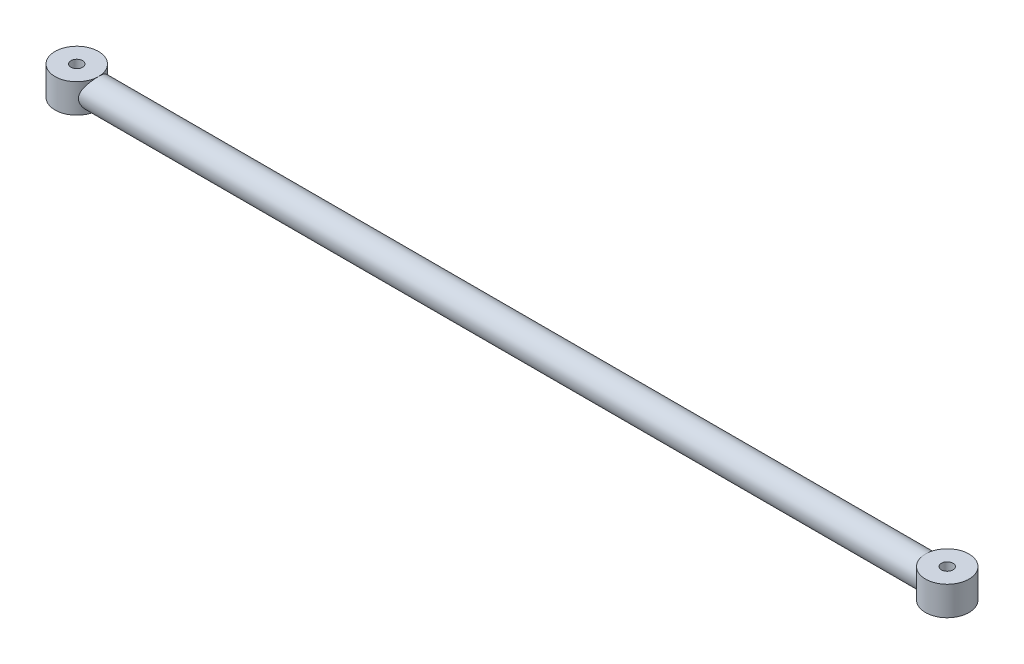
ISO-10303-21;
HEADER;
FILE_DESCRIPTION(('STEP AP214'),'2;1');
FILE_NAME('part.step','',(''),(''),'','','');
FILE_SCHEMA(('AUTOMOTIVE_DESIGN { 1 0 10303 214 1 1 1 1 }'));
ENDSEC;
DATA;
#1=APPLICATION_CONTEXT('core data for automotive mechanical design processes');
#2=APPLICATION_PROTOCOL_DEFINITION('international standard','automotive_design',2000,#1);
#3=PRODUCT_CONTEXT('',#1,'mechanical');
#4=PRODUCT('Part','Part','',(#3));
#5=PRODUCT_RELATED_PRODUCT_CATEGORY('part','',(#4));
#6=PRODUCT_DEFINITION_FORMATION('','',#4);
#7=PRODUCT_DEFINITION_CONTEXT('part definition',#1,'design');
#8=PRODUCT_DEFINITION('design','',#6,#7);
#9=PRODUCT_DEFINITION_SHAPE('','',#8);
#10=(LENGTH_UNIT() NAMED_UNIT(*) SI_UNIT(.MILLI.,.METRE.));
#11=(NAMED_UNIT(*) PLANE_ANGLE_UNIT() SI_UNIT($,.RADIAN.));
#12=(NAMED_UNIT(*) SI_UNIT($,.STERADIAN.) SOLID_ANGLE_UNIT());
#13=UNCERTAINTY_MEASURE_WITH_UNIT(LENGTH_MEASURE(1.E-05),#10,'distance_accuracy_value','');
#14=(GEOMETRIC_REPRESENTATION_CONTEXT(3) GLOBAL_UNCERTAINTY_ASSIGNED_CONTEXT((#13)) GLOBAL_UNIT_ASSIGNED_CONTEXT((#10,
#11,#12)) REPRESENTATION_CONTEXT('',''));
#15=CARTESIAN_POINT('',(0.,0.,0.));
#16=DIRECTION('',(0.,0.,1.));
#17=DIRECTION('',(1.,0.,0.));
#18=AXIS2_PLACEMENT_3D('',#15,#16,#17);
#19=CARTESIAN_POINT('',(0.,10.,0.));
#20=DIRECTION('',(0.,-1.,0.));
#21=DIRECTION('',(0.,0.,-1.));
#22=AXIS2_PLACEMENT_3D('',#19,#20,#21);
#23=CYLINDRICAL_SURFACE('',#22,7.5);
#24=CARTESIAN_POINT('',(5.59016994374947,5.,-5.));
#25=CARTESIAN_POINT('',(5.5901706625174,5.12205388359625,-4.99999964357564));
#26=CARTESIAN_POINT('',(5.59418532981739,5.24411789948403,-4.99552162160794));
#27=CARTESIAN_POINT('',(5.61003991638774,5.48708887638914,-4.97770938209618));
#28=CARTESIAN_POINT('',(5.62188108351868,5.6079956497761,-4.96437375228954));
#29=CARTESIAN_POINT('',(5.65283416335673,5.847752929154,-4.92909864587349));
#30=CARTESIAN_POINT('',(5.67195528501163,5.96660063056802,-4.90714827075304));
#31=CARTESIAN_POINT('',(5.71662095478366,6.20127131799252,-4.85504058407008));
#32=CARTESIAN_POINT('',(5.7421687886341,6.31709272323468,-4.82487907381622));
#33=CARTESIAN_POINT('',(5.82639663379158,6.65668003821921,-4.72342806910663));
#34=CARTESIAN_POINT('',(5.89303629120037,6.8751813364103,-4.64077239770027));
#35=CARTESIAN_POINT('',(6.03960512128253,7.29470249417751,-4.44834576156935));
#36=CARTESIAN_POINT('',(6.11953705272864,7.49571871155765,-4.33856916567418));
#37=CARTESIAN_POINT('',(6.29865991433558,7.9091252663264,-4.07504436525903));
#38=CARTESIAN_POINT('',(6.39891196365178,8.11841562351777,-3.917111460503));
#39=CARTESIAN_POINT('',(6.54866950717716,8.41205464650507,-3.65718550420727));
#40=CARTESIAN_POINT('',(6.59852398957,8.50661752220399,-3.56662594393892));
#41=CARTESIAN_POINT('',(6.69705344049372,8.68868505677082,-3.3779849735163));
#42=CARTESIAN_POINT('',(6.74572816721061,8.77618827704165,-3.27990203817314));
#43=CARTESIAN_POINT('',(6.84778975627652,8.95581205432809,-3.06174885112188));
#44=CARTESIAN_POINT('',(6.90083673852273,9.04676291382604,-2.94055246314321));
#45=CARTESIAN_POINT('',(7.00261387401659,9.21797779217798,-2.68919540612318));
#46=CARTESIAN_POINT('',(7.05134586467213,9.2982463671529,-2.55903859498151));
#47=CARTESIAN_POINT('',(7.14311288700486,9.44719011504436,-2.29042949522774));
#48=CARTESIAN_POINT('',(7.18615113246434,9.51587183413288,-2.15198195090786));
#49=CARTESIAN_POINT('',(7.26523919200859,9.64069315005232,-1.86763465972573));
#50=CARTESIAN_POINT('',(7.30129050280678,9.69683543342512,-1.72173651738078));
#51=CARTESIAN_POINT('',(7.36162681849092,9.79005883635526,-1.44040606590123));
#52=CARTESIAN_POINT('',(7.38677766936309,9.82857099214886,-1.30563322030059));
#53=CARTESIAN_POINT('',(7.42991249444935,9.89430447806799,-1.03224885423915));
#54=CARTESIAN_POINT('',(7.44789787222761,9.92152801943628,-0.893638091239558));
#55=CARTESIAN_POINT('',(7.47614687179729,9.96417435933857,-0.61397210260027));
#56=CARTESIAN_POINT('',(7.48641808298536,9.97960875659256,-0.472919419564069));
#57=CARTESIAN_POINT('',(7.49894084318428,9.9984162055763,-0.189664806486311));
#58=CARTESIAN_POINT('',(7.50119352373448,10.0017909591096,-0.0474630414368964));
#59=CARTESIAN_POINT('',(7.49788711593105,9.99683002098599,0.214926329417986));
#60=CARTESIAN_POINT('',(7.49346652031666,9.99020106877646,0.33516525258883));
#61=CARTESIAN_POINT('',(7.47892220840115,9.96833417713567,0.574546655888795));
#62=CARTESIAN_POINT('',(7.46879682307761,9.95309371827425,0.693688804767769));
#63=CARTESIAN_POINT('',(7.44307061859246,9.91421546893757,0.929951983638574));
#64=CARTESIAN_POINT('',(7.4274716617223,9.89058053450934,1.04707368685166));
#65=CARTESIAN_POINT('',(7.39114068429177,9.83522389783409,1.27859356391292));
#66=CARTESIAN_POINT('',(7.37040667326084,9.80349905960406,1.39299066274564));
#67=CARTESIAN_POINT('',(7.30131486330501,9.69703681289823,1.73005538403762));
#68=CARTESIAN_POINT('',(7.24593117994871,9.61081085923641,1.94778792718831));
#69=CARTESIAN_POINT('',(7.12052338075279,9.4111078189108,2.36556151611647));
#70=CARTESIAN_POINT('',(7.05049659276983,9.29762575786053,2.56559932338025));
#71=CARTESIAN_POINT('',(6.89045638386269,9.03006024279277,2.97069368982936));
#72=CARTESIAN_POINT('',(6.79902578768085,8.87260106479221,3.17295552552388));
#73=CARTESIAN_POINT('',(6.60999945158181,8.53023339768211,3.54999339995416));
#74=CARTESIAN_POINT('',(6.51239433736308,8.34528256627919,3.7247261681595));
#75=CARTESIAN_POINT('',(6.35967478305087,8.03402018008872,3.97696265964104));
#76=CARTESIAN_POINT('',(6.30400799743458,7.91589183940307,4.06438394782657));
#77=CARTESIAN_POINT('',(6.19484436036359,7.67171142735368,4.2289079044222));
#78=CARTESIAN_POINT('',(6.14134799901609,7.54565758252332,4.30600825118179));
#79=CARTESIAN_POINT('',(5.98694245327993,7.15642167168728,4.52077878477497));
#80=CARTESIAN_POINT('',(5.89179835434539,6.88155132549681,4.64241912020699));
#81=CARTESIAN_POINT('',(5.75656527679014,6.38812992147349,4.80833516081298));
#82=CARTESIAN_POINT('',(5.70851355325226,6.17586848148356,4.86478068831081));
#83=CARTESIAN_POINT('',(5.65350806810432,5.85066319889901,4.92834585425333));
#84=CARTESIAN_POINT('',(5.63802041673228,5.74116095113767,4.94601484280339));
#85=CARTESIAN_POINT('',(5.6132864702714,5.52054688860994,4.97407050656186));
#86=CARTESIAN_POINT('',(5.60403790489399,5.40943567436659,4.98445983075943));
#87=CARTESIAN_POINT('',(5.59214106690608,5.18589940571024,4.997803260487));
#88=CARTESIAN_POINT('',(5.58952331669792,5.07347066025993,5.00072298319807));
#89=CARTESIAN_POINT('',(5.59108732012691,4.84872057527093,4.99897430202887));
#90=CARTESIAN_POINT('',(5.59526909006742,4.73639923599042,4.99430587995434));
#91=CARTESIAN_POINT('',(5.61025801127053,4.5127095471556,4.97746238755042));
#92=CARTESIAN_POINT('',(5.62106859529239,4.40134172170081,4.96528342783884));
#93=CARTESIAN_POINT('',(5.64886572819769,4.18041300109456,4.9336347125069));
#94=CARTESIAN_POINT('',(5.66585478194021,4.0708528576679,4.9141619997762));
#95=CARTESIAN_POINT('',(5.72320177022745,3.75666065472961,4.84750655123214));
#96=CARTESIAN_POINT('',(5.77082982352627,3.55521807244575,4.79115844570636));
#97=CARTESIAN_POINT('',(5.88074881106741,3.16464705118105,4.6555719559158));
#98=CARTESIAN_POINT('',(5.94304466833049,2.97552277391524,4.57632588427075));
#99=CARTESIAN_POINT('',(6.09028500694758,2.57451319098662,4.37908973742576));
#100=CARTESIAN_POINT('',(6.17726765213988,2.36563426365981,4.25652155676044));
#101=CARTESIAN_POINT('',(6.35657226537142,1.96893166875292,3.98379742572386));
#102=CARTESIAN_POINT('',(6.44890063945384,1.7811340900701,3.83360788608274));
#103=CARTESIAN_POINT('',(6.59617273726703,1.49744748224256,3.57120985773432));
#104=CARTESIAN_POINT('',(6.65164798701944,1.39428654949147,3.46704479819889));
#105=CARTESIAN_POINT('',(6.76059384112445,1.19705427014105,3.24948474866213));
#106=CARTESIAN_POINT('',(6.81406502122924,1.10298030049269,3.13609243972305));
#107=CARTESIAN_POINT('',(6.91762986331369,0.924601972371946,2.9005088898478));
#108=CARTESIAN_POINT('',(6.96772501047729,0.840293306061031,2.77832156758735));
#109=CARTESIAN_POINT('',(7.06324889339064,0.682193574462971,2.52561765880675));
#110=CARTESIAN_POINT('',(7.10867901103764,0.608399392000351,2.39510355756627));
#111=CARTESIAN_POINT('',(7.18545886075459,0.485283528930507,2.15224191391206));
#112=CARTESIAN_POINT('',(7.21783719911202,0.433983582257362,2.04121853633071));
#113=CARTESIAN_POINT('',(7.27809690900046,0.339310306340049,1.81467232523617));
#114=CARTESIAN_POINT('',(7.30597918543269,0.295935381829555,1.6991504029492));
#115=CARTESIAN_POINT('',(7.35665725512397,0.217605458657127,1.4642485000991));
#116=CARTESIAN_POINT('',(7.37945517519233,0.182646938886476,1.344870156709));
#117=CARTESIAN_POINT('',(7.41946190632175,0.121583530791129,1.10299691877027));
#118=CARTESIAN_POINT('',(7.43667297862896,0.0954750602674704,0.980503306811374));
#119=CARTESIAN_POINT('',(7.46517779300979,0.0523598766374048,0.732635305372838));
#120=CARTESIAN_POINT('',(7.47644323427494,0.0353966863758577,0.607250051109774));
#121=CARTESIAN_POINT('',(7.49265147038709,0.0110212309196953,0.355144734240186));
#122=CARTESIAN_POINT('',(7.49759425522424,0.0036089808458646,0.228424669520747));
#123=CARTESIAN_POINT('',(7.50103025873025,-0.00154563348941496,-0.0252924710734001));
#124=CARTESIAN_POINT('',(7.49952386162054,0.000711426182921558,-0.152289529995143));
#125=CARTESIAN_POINT('',(7.49010159691518,0.0148571234438512,-0.405499509626763));
#126=CARTESIAN_POINT('',(7.48218602101529,0.0267453226982451,-0.531712465759452));
#127=CARTESIAN_POINT('',(7.46095100810477,0.0587529202728431,-0.773178498860274));
#128=CARTESIAN_POINT('',(7.448068464009,0.0782077409701473,-0.888558797390637));
#129=CARTESIAN_POINT('',(7.41724576819145,0.124978122892729,-1.11704156047781));
#130=CARTESIAN_POINT('',(7.399303905766,0.152296343028638,-1.23014324068349));
#131=CARTESIAN_POINT('',(7.33841301643864,0.245573715508718,-1.56492273869531));
#132=CARTESIAN_POINT('',(7.28838026742236,0.322882666524126,-1.78227445561561));
#133=CARTESIAN_POINT('',(7.16979112357417,0.509852973814495,-2.21290412009764));
#134=CARTESIAN_POINT('',(7.1003304156043,0.621127488703141,-2.42521863658466));
#135=CARTESIAN_POINT('',(6.94938601442567,0.87037489056778,-2.82887198732711));
#136=CARTESIAN_POINT('',(6.86789513405988,1.00836375288544,-3.02019816263525));
#137=CARTESIAN_POINT('',(6.684823034606,1.33157302773962,-3.40823875779305));
#138=CARTESIAN_POINT('',(6.582097841658,1.52080858466487,-3.60106785648602));
#139=CARTESIAN_POINT('',(6.37633394651734,1.92778282762101,-3.95399968805939));
#140=CARTESIAN_POINT('',(6.27329506780276,2.14554263863128,-4.11407793841239));
#141=CARTESIAN_POINT('',(6.08460555354049,2.58967205587941,-4.38783158705922));
#142=CARTESIAN_POINT('',(5.99822799554583,2.81411549521951,-4.50411638942043));
#143=CARTESIAN_POINT('',(5.84368671439486,3.28320017359626,-4.70289484194104));
#144=CARTESIAN_POINT('',(5.77548769703612,3.52780104889743,-4.78545413974288));
#145=CARTESIAN_POINT('',(5.67977869968879,3.97696033843683,-4.89840704223489));
#146=CARTESIAN_POINT('',(5.64660042641953,4.17837658974286,-4.93630728698343));
#147=CARTESIAN_POINT('',(5.61296953532588,4.48444930958915,-4.97441665993171));
#148=CARTESIAN_POINT('',(5.6044486251871,4.58713925604258,-4.98399630030355));
#149=CARTESIAN_POINT('',(5.59304922754417,4.79321716479006,-4.99678732833624));
#150=CARTESIAN_POINT('',(5.59016933486227,4.89660494681258,-5.00000030193645));
#151=CARTESIAN_POINT('',(5.59016994374947,5.,-5.));
#152=B_SPLINE_CURVE_WITH_KNOTS('',3,(#24,#25,#26,#27,#28,#29,#30,#31,#32,#33,#34,#35,#36,#37,
#38,#39,#40,#41,#42,#43,#44,#45,#46,#47,#48,#49,#50,#51,#52,#53,#54,#55,#56,#57,#58,#59,#60,#61,
#62,#63,#64,#65,#66,#67,#68,#69,#70,#71,#72,#73,#74,#75,#76,#77,#78,#79,#80,#81,#82,#83,#84,#85,
#86,#87,#88,#89,#90,#91,#92,#93,#94,#95,#96,#97,#98,#99,#100,#101,#102,#103,#104,#105,#106,#107,
#108,#109,#110,#111,#112,#113,#114,#115,#116,#117,#118,#119,#120,#121,#122,#123,#124,#125,#126,
#127,#128,#129,#130,#131,#132,#133,#134,#135,#136,#137,#138,#139,#140,#141,#142,#143,#144,#145,
#146,#147,#148,#149,#150,#151),.UNSPECIFIED.,.T.,.F.,(4,2,2,2,2,2,2,2,2,2,2,2,2,2,2,2,2,2,2,2,2,
2,2,2,2,2,2,2,2,2,2,2,2,2,2,2,2,2,2,2,2,2,2,2,2,2,2,2,2,2,2,2,2,2,2,2,2,2,2,2,2,2,2,4),(0.,
0.366033458672971,0.732125291964981,1.09868176861093,1.46542603387433,2.19101005626679,
2.91674485988983,3.75544535494702,4.17545267241678,4.59554536276913,5.07654048587601,
5.55732979684682,6.03784656220448,6.51826027911534,6.94483544019723,7.37132700312484,
7.79739842098889,8.22340971116697,8.5844789808514,8.94565394170145,9.30670613775418,
9.6678985059721,10.3866783482082,11.1055894714534,11.9189706975283,12.7336179187696,
13.2045491800071,13.6755861977901,14.6151303537652,15.2867708701996,15.622382916626,
15.9578727740365,16.2949041462506,16.6319363265738,16.9691431880032,17.3064869116396,
17.9474746151418,18.5886777636667,19.3580440738515,20.1283522425805,20.5981214540359,
21.0677546537896,21.5371798854196,22.0064656580781,22.3856357517165,22.7647294360678,
23.1436642451331,23.5224454906107,23.9030138094417,24.2835827307772,24.664128979362,
25.0446579094287,25.3973949464228,25.7502513974508,26.4553650385285,27.2012784158551,
27.9476392394848,28.8113869983205,29.6757781016727,30.4741849861256,31.2710302574382,
31.891247248814,32.201401082632,32.5114776472832),.UNSPECIFIED.);
#153=CARTESIAN_POINT('',(7.5,10.,0.));
#154=VERTEX_POINT('',#153);
#155=CARTESIAN_POINT('',(7.5,0.,0.));
#156=VERTEX_POINT('',#155);
#157=EDGE_CURVE('E74',#154,#156,#152,.T.);
#158=ORIENTED_EDGE('',*,*,#157,.F.);
#159=CARTESIAN_POINT('',(0.,10.,0.));
#160=DIRECTION('',(0.,1.,0.));
#161=DIRECTION('',(0.,0.,1.));
#162=AXIS2_PLACEMENT_3D('',#159,#160,#161);
#163=CIRCLE('',#162,7.5);
#164=EDGE_CURVE('E45',#154,#154,#163,.T.);
#165=ORIENTED_EDGE('',*,*,#164,.F.);
#166=CARTESIAN_POINT('',(7.5,10.,0.));
#167=CARTESIAN_POINT('',(7.49999996320963,9.99999996332958,0.125608018588548));
#168=CARTESIAN_POINT('',(7.49683780664486,9.99526045609656,0.251216670884861));
#169=CARTESIAN_POINT('',(7.48426887523008,9.97637719344278,0.501407130429646));
#170=CARTESIAN_POINT('',(7.47486206751269,9.96223338852455,0.625988932270019));
#171=CARTESIAN_POINT('',(7.45003382341075,9.92475388496588,0.873171719994341));
#172=CARTESIAN_POINT('',(7.43461128487837,9.90141650195336,0.99577233861483));
#173=CARTESIAN_POINT('',(7.39811136676745,9.84587344243482,1.23813427215697));
#174=CARTESIAN_POINT('',(7.37703158367565,9.8136639964275,1.35789435666897));
#175=CARTESIAN_POINT('',(7.32981525375344,9.74098638489601,1.59314893798378));
#176=CARTESIAN_POINT('',(7.30370546494928,9.70056186113887,1.70866231614512));
#177=CARTESIAN_POINT('',(7.24690654349893,9.61181215495731,1.93546860882204));
#178=CARTESIAN_POINT('',(7.21621562725325,9.56348389461676,2.04675985824914));
#179=CARTESIAN_POINT('',(7.11817827260879,9.40738741786011,2.37341381762447));
#180=CARTESIAN_POINT('',(7.04482484943509,9.28844372586616,2.58175996249981));
#181=CARTESIAN_POINT('',(6.88067945428324,9.01334849863612,2.99324442404474));
#182=CARTESIAN_POINT('',(6.78893589581815,8.85489609546823,3.19444057723902));
#183=CARTESIAN_POINT('',(6.59954434905881,8.51065910883303,3.56933031224002));
#184=CARTESIAN_POINT('',(6.5018880214744,8.32483536621252,3.74298373794807));
#185=CARTESIAN_POINT('',(6.34919628009922,8.01202024399453,3.99366214280298));
#186=CARTESIAN_POINT('',(6.29351311736736,7.89316385177453,4.08060552383283));
#187=CARTESIAN_POINT('',(6.18443450280949,7.6475199343164,4.24410607449973));
#188=CARTESIAN_POINT('',(6.13103957232405,7.52073061769333,4.32066088576892));
#189=CARTESIAN_POINT('',(5.97715554289977,7.12929062591451,4.53366662201286));
#190=CARTESIAN_POINT('',(5.88264084043698,6.85293596756271,4.65396866792279));
#191=CARTESIAN_POINT('',(5.74940066178898,6.35814923705589,4.81686735383668));
#192=CARTESIAN_POINT('',(5.70244638338744,6.1460313437967,4.87187088253824));
#193=CARTESIAN_POINT('',(5.64915905133327,5.8212576931191,4.93332515657475));
#194=CARTESIAN_POINT('',(5.63425589706967,5.7119348309963,4.95029943249));
#195=CARTESIAN_POINT('',(5.61069296640748,5.49175738437376,4.97699249744458));
#196=CARTESIAN_POINT('',(5.6020309479698,5.38090336452041,4.98671389202271));
#197=CARTESIAN_POINT('',(5.59128886396067,5.15799242550824,4.99875512937179));
#198=CARTESIAN_POINT('',(5.58923742257986,5.04593237757908,5.00104278396599));
#199=CARTESIAN_POINT('',(5.5918825450767,4.82199293530448,4.9980849918467));
#200=CARTESIAN_POINT('',(5.59657913187616,4.71011354157399,4.99283951954458));
#201=CARTESIAN_POINT('',(5.61252620448123,4.48736390866386,4.97490634187683));
#202=CARTESIAN_POINT('',(5.62378029227563,4.37649425814924,4.96221454627213));
#203=CARTESIAN_POINT('',(5.65238050674852,4.15660343554882,4.92961024185719));
#204=CARTESIAN_POINT('',(5.66972910561612,4.04758303243614,4.90969480272766));
#205=CARTESIAN_POINT('',(5.72818076911837,3.73396543495533,4.84163703367357));
#206=CARTESIAN_POINT('',(5.77653702126334,3.53263370716592,4.78429713380928));
#207=CARTESIAN_POINT('',(5.88774075486078,3.14240371216595,4.64674861534595));
#208=CARTESIAN_POINT('',(5.95059300345544,2.9535095614946,4.56653247162609));
#209=CARTESIAN_POINT('',(6.09910267461486,2.55245469859575,4.36685173998334));
#210=CARTESIAN_POINT('',(6.18679835791932,2.34337672502797,4.24272264703471));
#211=CARTESIAN_POINT('',(6.36729804082079,1.94651500271284,3.96670264496564));
#212=CARTESIAN_POINT('',(6.46010824109834,1.75875798567564,3.81477749526626));
#213=CARTESIAN_POINT('',(6.60779163713999,1.47562744199996,3.54969108213473));
#214=CARTESIAN_POINT('',(6.66328847782504,1.37286916827723,3.44464766421749));
#215=CARTESIAN_POINT('',(6.77217054484313,1.17652286029991,3.22531791748826));
#216=CARTESIAN_POINT('',(6.82555639146258,1.0829321201714,3.11103433427816));
#217=CARTESIAN_POINT('',(6.92883688982357,0.905617664374111,2.87366828778324));
#218=CARTESIAN_POINT('',(6.97873321853711,0.821889195729718,2.75059010925358));
#219=CARTESIAN_POINT('',(7.07374288615761,0.665057023586969,2.49611507932344));
#220=CARTESIAN_POINT('',(7.11885767470596,0.591950097400154,2.36472076856899));
#221=CARTESIAN_POINT('',(7.1947926112122,0.470449962892977,2.12083178608808));
#222=CARTESIAN_POINT('',(7.22668145195663,0.420021256692504,2.00967972723592));
#223=CARTESIAN_POINT('',(7.2859316600916,0.32709058125619,1.78295269143194));
#224=CARTESIAN_POINT('',(7.31329394408637,0.284587007000184,1.66737861576613));
#225=CARTESIAN_POINT('',(7.36291212748662,0.207993540162689,1.43245611415626));
#226=CARTESIAN_POINT('',(7.38517017742725,0.173900103730211,1.31310930196114));
#227=CARTESIAN_POINT('',(7.42408961793734,0.114551323245833,1.07138735730615));
#228=CARTESIAN_POINT('',(7.44075325872844,0.0892924255338536,0.94901346373659));
#229=CARTESIAN_POINT('',(7.4681644674329,0.0478566795824793,0.701493288803489));
#230=CARTESIAN_POINT('',(7.4788845658993,0.0317219942473324,0.57633687025973));
#231=CARTESIAN_POINT('',(7.4940239148013,0.00896134388119637,0.324780008160029));
#232=CARTESIAN_POINT('',(7.49844315700379,0.00233539127495145,0.198379562978777));
#233=CARTESIAN_POINT('',(7.50086789804063,-0.00130194416532314,-0.0546163050195388));
#234=CARTESIAN_POINT('',(7.49887366122603,0.0016862767232409,-0.18121171958537));
#235=CARTESIAN_POINT('',(7.48852351947421,0.0172278979729268,-0.43354493783257));
#236=CARTESIAN_POINT('',(7.48016788605485,0.0297808900894156,-0.559282777885931));
#237=CARTESIAN_POINT('',(7.45811180800349,0.0630398424416899,-0.800084092730026));
#238=CARTESIAN_POINT('',(7.44483013834048,0.0831079633674689,-0.91527468950311));
#239=CARTESIAN_POINT('',(7.41323727394235,0.131077444891408,-1.14332502618366));
#240=CARTESIAN_POINT('',(7.39492437584217,0.158981458468383,-1.25618396274927));
#241=CARTESIAN_POINT('',(7.33297199401165,0.253967301110013,-1.59016819827962));
#242=CARTESIAN_POINT('',(7.28229985688257,0.332350843413179,-1.80689828647146));
#243=CARTESIAN_POINT('',(7.16240567052806,0.521637142016869,-2.2366977314704));
#244=CARTESIAN_POINT('',(7.09224590701723,0.634222108945026,-2.44875011842611));
#245=CARTESIAN_POINT('',(6.94004723718924,0.88608150005795,-2.8516978970661));
#246=CARTESIAN_POINT('',(6.85800100215921,1.02537240729556,-3.04258010694991));
#247=CARTESIAN_POINT('',(6.67386338599776,1.35152024255087,-3.42963933761377));
#248=CARTESIAN_POINT('',(6.57065384591325,1.54241580633922,-3.62188054324072));
#249=CARTESIAN_POINT('',(6.36427940129081,1.95277841863379,-3.97334834714672));
#250=CARTESIAN_POINT('',(6.26111457639159,2.17226504546276,-4.13255212685989));
#251=CARTESIAN_POINT('',(6.07349195966786,2.61785607980173,-4.40311961015303));
#252=CARTESIAN_POINT('',(5.98818993185448,2.8418301361395,-4.51739093945808));
#253=CARTESIAN_POINT('',(5.83597435045316,3.30968157872016,-4.71240530724639));
#254=CARTESIAN_POINT('',(5.76902777392137,3.55352218410378,-4.79320869285461));
#255=CARTESIAN_POINT('',(5.67333023681701,4.01141135057003,-4.90589604497064));
#256=CARTESIAN_POINT('',(5.63987506376385,4.22292997208489,-4.94396476310194));
#257=CARTESIAN_POINT('',(5.59698654785069,4.65143275638778,-4.99248032394649));
#258=CARTESIAN_POINT('',(5.58752711368552,4.8684107234815,-5.00295716862677));
#259=CARTESIAN_POINT('',(5.59410544900805,5.30160929715586,-4.99559738764621));
#260=CARTESIAN_POINT('',(5.61015831597501,5.51782937934327,-4.97774399693959));
#261=CARTESIAN_POINT('',(5.66525973970472,5.94335263717476,-4.91492740617482));
#262=CARTESIAN_POINT('',(5.7043389738479,6.15264619119368,-4.8699280383881));
#263=CARTESIAN_POINT('',(5.81317852459072,6.61430721309001,-4.73981418276009));
#264=CARTESIAN_POINT('',(5.88833948649796,6.86329193737393,-4.64720557432273));
#265=CARTESIAN_POINT('',(6.0137282216154,7.2197721527126,-4.48217153169634));
#266=CARTESIAN_POINT('',(6.05768608443999,7.33588098122704,-4.4227291606703));
#267=CARTESIAN_POINT('',(6.14853438480218,7.5622633756569,-4.29553797555823));
#268=CARTESIAN_POINT('',(6.19542487694525,7.67253683284727,-4.22778900678103));
#269=CARTESIAN_POINT('',(6.34038233699541,7.99813157273274,-4.0100125161287));
#270=CARTESIAN_POINT('',(6.44119239434723,8.20406498890247,-3.84739387541879));
#271=CARTESIAN_POINT('',(6.5908294854328,8.49223623047968,-3.58070368138863));
#272=CARTESIAN_POINT('',(6.64046727146307,8.5848751310009,-3.48796686520542));
#273=CARTESIAN_POINT('',(6.73828470699057,8.76298200605058,-3.29502624182907));
#274=CARTESIAN_POINT('',(6.78646402214188,8.84844834415119,-3.19482074044039));
#275=CARTESIAN_POINT('',(6.88712610322217,9.02347385839299,-2.97228582382091));
#276=CARTESIAN_POINT('',(6.93922872778526,9.11184847540997,-2.84884898400047));
#277=CARTESIAN_POINT('',(7.03877400576411,9.27770219318705,-2.59315796105783));
#278=CARTESIAN_POINT('',(7.08621876519301,9.35518622493486,-2.46090780863046));
#279=CARTESIAN_POINT('',(7.17506685821063,9.49830278427693,-2.18836443414477));
#280=CARTESIAN_POINT('',(7.21647581452225,9.56394635570691,-2.04807886951547));
#281=CARTESIAN_POINT('',(7.29200187013099,9.68245428044414,-1.76034275764725));
#282=CARTESIAN_POINT('',(7.32612152964091,9.73532312146547,-1.61289474847383));
#283=CARTESIAN_POINT('',(7.37927647812224,9.81710032821547,-1.34555428333911));
#284=CARTESIAN_POINT('',(7.39997893582426,9.84872238892977,-1.22681585673932));
#285=CARTESIAN_POINT('',(7.43582405760531,9.90325435730034,-0.986541218916703));
#286=CARTESIAN_POINT('',(7.45096786434905,9.9261660555379,-0.865005588166456));
#287=CARTESIAN_POINT('',(7.47533722218222,9.96294834023699,-0.620058880061074));
#288=CARTESIAN_POINT('',(7.48456629083545,9.97682430043647,-0.496648962158442));
#289=CARTESIAN_POINT('',(7.49689781286771,9.99535032150822,-0.24882626170185));
#290=CARTESIAN_POINT('',(7.50000003644048,10.0000000363217,-0.12441344170668));
#291=CARTESIAN_POINT('',(7.5,10.,0.));
#292=B_SPLINE_CURVE_WITH_KNOTS('',3,(#166,#167,#168,#169,#170,#171,#172,#173,#174,#175,#176,
#177,#178,#179,#180,#181,#182,#183,#184,#185,#186,#187,#188,#189,#190,#191,#192,#193,#194,#195,
#196,#197,#198,#199,#200,#201,#202,#203,#204,#205,#206,#207,#208,#209,#210,#211,#212,#213,#214,
#215,#216,#217,#218,#219,#220,#221,#222,#223,#224,#225,#226,#227,#228,#229,#230,#231,#232,#233,
#234,#235,#236,#237,#238,#239,#240,#241,#242,#243,#244,#245,#246,#247,#248,#249,#250,#251,#252,
#253,#254,#255,#256,#257,#258,#259,#260,#261,#262,#263,#264,#265,#266,#267,#268,#269,#270,#271,
#272,#273,#274,#275,#276,#277,#278,#279,#280,#281,#282,#283,#284,#285,#286,#287,#288,#289,#290,
#291),.UNSPECIFIED.,.T.,.F.,(4,2,2,2,2,2,2,2,2,2,2,2,2,2,2,2,2,2,2,2,2,2,2,2,2,2,2,2,2,2,2,2,2,
2,2,2,2,2,2,2,2,2,2,2,2,2,2,2,2,2,2,2,2,2,2,2,2,2,2,2,2,2,4),(0.,0.376697150092868,
0.7533962828654,1.13016446348966,1.5070929703719,1.88206910413628,2.2571916123895,
3.00679232609858,3.82000195441008,4.63438651949459,5.10618372652057,5.57808786035319,
6.5193034140896,7.18876311985436,7.52328813363274,7.85769291407032,8.19354375486222,
8.52939573647986,8.86543237335315,9.20160547846822,9.84356710192613,10.4857401421745,
11.2585349135694,12.032288141549,12.5030398312138,12.9736521532471,13.44403673454,
13.9142782967795,14.2923626335413,14.6703703162267,15.0482184414745,15.4259144034603,
15.8053417246619,16.184769541648,16.5641817195628,16.9435777042718,17.2962009039366,
17.6489436346054,18.3538353932503,19.1014251855315,19.8494778884237,20.7158209183258,
21.5827603441875,22.3763648974055,23.1685321808116,23.8182177151969,24.4671965231208,
25.1165595219072,25.7667896111035,26.5902817323984,27.0029102138176,27.4155463806554,
28.2552096763187,28.6754157798874,29.0957174947647,29.5765774176914,30.0572189128906,
30.5374097593981,31.0174316706402,31.3908313299587,31.7641541882901,32.1372548206284,
32.5103694469936),.UNSPECIFIED.);
#293=EDGE_CURVE('E11',#156,#154,#292,.T.);
#294=ORIENTED_EDGE('',*,*,#293,.F.);
#295=CARTESIAN_POINT('',(0.,0.,0.));
#296=DIRECTION('',(0.,1.,0.));
#297=DIRECTION('',(0.,0.,1.));
#298=AXIS2_PLACEMENT_3D('',#295,#296,#297);
#299=CIRCLE('',#298,7.5);
#300=EDGE_CURVE('E124',#156,#156,#299,.T.);
#301=ORIENTED_EDGE('',*,*,#300,.T.);
#302=EDGE_LOOP('',(#158,#165,#294,#301));
#303=FACE_BOUND('',#302,.T.);
#304=ADVANCED_FACE('F33',(#303),#23,.T.);
#305=CARTESIAN_POINT('',(0.,10.,0.));
#306=DIRECTION('',(0.,1.,0.));
#307=DIRECTION('',(0.,0.,1.));
#308=AXIS2_PLACEMENT_3D('',#305,#306,#307);
#309=PLANE('',#308);
#310=ORIENTED_EDGE('',*,*,#164,.T.);
#311=EDGE_LOOP('',(#310));
#312=FACE_BOUND('',#311,.T.);
#313=CARTESIAN_POINT('',(0.,10.,0.));
#314=DIRECTION('',(0.,1.,0.));
#315=DIRECTION('',(0.,0.,1.));
#316=AXIS2_PLACEMENT_3D('',#313,#314,#315);
#317=CIRCLE('',#316,2.);
#318=CARTESIAN_POINT('',(0.,10.,2.));
#319=VERTEX_POINT('',#318);
#320=EDGE_CURVE('E88',#319,#319,#317,.T.);
#321=ORIENTED_EDGE('',*,*,#320,.F.);
#322=EDGE_LOOP('',(#321));
#323=FACE_BOUND('',#322,.T.);
#324=ADVANCED_FACE('F114',(#312,#323),#309,.T.);
#325=CARTESIAN_POINT('',(0.,0.,0.));
#326=DIRECTION('',(0.,1.,0.));
#327=DIRECTION('',(0.,0.,1.));
#328=AXIS2_PLACEMENT_3D('',#325,#326,#327);
#329=PLANE('',#328);
#330=ORIENTED_EDGE('',*,*,#300,.F.);
#331=EDGE_LOOP('',(#330));
#332=FACE_BOUND('',#331,.T.);
#333=CARTESIAN_POINT('',(0.,0.,0.));
#334=DIRECTION('',(0.,1.,0.));
#335=DIRECTION('',(0.,0.,1.));
#336=AXIS2_PLACEMENT_3D('',#333,#334,#335);
#337=CIRCLE('',#336,2.);
#338=CARTESIAN_POINT('',(0.,0.,2.));
#339=VERTEX_POINT('',#338);
#340=EDGE_CURVE('E68',#339,#339,#337,.T.);
#341=ORIENTED_EDGE('',*,*,#340,.T.);
#342=EDGE_LOOP('',(#341));
#343=FACE_BOUND('',#342,.T.);
#344=ADVANCED_FACE('F118',(#332,#343),#329,.F.);
#345=CARTESIAN_POINT('',(0.,10.,0.));
#346=DIRECTION('',(0.,-1.,0.));
#347=DIRECTION('',(0.,0.,-1.));
#348=AXIS2_PLACEMENT_3D('',#345,#346,#347);
#349=CYLINDRICAL_SURFACE('',#348,2.);
#350=ORIENTED_EDGE('',*,*,#320,.T.);
#351=EDGE_LOOP('',(#350));
#352=FACE_BOUND('',#351,.T.);
#353=ORIENTED_EDGE('',*,*,#340,.F.);
#354=EDGE_LOOP('',(#353));
#355=FACE_BOUND('',#354,.T.);
#356=ADVANCED_FACE('F126',(#352,#355),#349,.F.);
#357=CARTESIAN_POINT('',(307.501,5.,0.));
#358=DIRECTION('',(-1.,0.,0.));
#359=DIRECTION('',(0.,0.,1.));
#360=AXIS2_PLACEMENT_3D('',#357,#358,#359);
#361=CYLINDRICAL_SURFACE('',#360,5.);
#362=CARTESIAN_POINT('',(294.40983005625,5.,5.));
#363=CARTESIAN_POINT('',(294.409829337483,4.87794611640375,4.99999964357564));
#364=CARTESIAN_POINT('',(294.405814670183,4.75588210051598,4.99552162160794));
#365=CARTESIAN_POINT('',(294.389960083612,4.51291112361087,4.97770938209618));
#366=CARTESIAN_POINT('',(294.378118916481,4.3920043502239,4.96437375228954));
#367=CARTESIAN_POINT('',(294.347165836643,4.152247070846,4.92909864587349));
#368=CARTESIAN_POINT('',(294.328044714988,4.03339936943199,4.90714827075304));
#369=CARTESIAN_POINT('',(294.283379045216,3.79872868200749,4.85504058407008));
#370=CARTESIAN_POINT('',(294.257831211366,3.68290727676532,4.82487907381622));
#371=CARTESIAN_POINT('',(294.173603366208,3.34331996178078,4.72342806910662));
#372=CARTESIAN_POINT('',(294.1069637088,3.12481866358968,4.64077239770027));
#373=CARTESIAN_POINT('',(293.960394878717,2.70529750582248,4.44834576156934));
#374=CARTESIAN_POINT('',(293.880462947271,2.50428128844234,4.33856916567417));
#375=CARTESIAN_POINT('',(293.701340085664,2.09087473367359,4.07504436525902));
#376=CARTESIAN_POINT('',(293.601088036348,1.88158437648223,3.917111460503));
#377=CARTESIAN_POINT('',(293.451330492823,1.58794535349493,3.65718550420726));
#378=CARTESIAN_POINT('',(293.40147601043,1.493382477796,3.56662594393891));
#379=CARTESIAN_POINT('',(293.302946559506,1.31131494322917,3.37798497351629));
#380=CARTESIAN_POINT('',(293.254271832789,1.22381172295835,3.27990203817314));
#381=CARTESIAN_POINT('',(293.152210243723,1.04418794567191,3.06174885112189));
#382=CARTESIAN_POINT('',(293.099163261477,0.953237086173965,2.94055246314323));
#383=CARTESIAN_POINT('',(292.997386125983,0.78202220782203,2.68919540612319));
#384=CARTESIAN_POINT('',(292.948654135328,0.701753632847106,2.55903859498152));
#385=CARTESIAN_POINT('',(292.856887112995,0.552809884955645,2.29042949522774));
#386=CARTESIAN_POINT('',(292.813848867536,0.484128165867123,2.15198195090786));
#387=CARTESIAN_POINT('',(292.734760807991,0.359306849947681,1.86763465972573));
#388=CARTESIAN_POINT('',(292.698709497193,0.303164566574879,1.72173651738078));
#389=CARTESIAN_POINT('',(292.638373181509,0.20994116364474,1.44040606590122));
#390=CARTESIAN_POINT('',(292.613222330637,0.171429007851139,1.30563322030059));
#391=CARTESIAN_POINT('',(292.570087505551,0.105695521932006,1.03224885423916));
#392=CARTESIAN_POINT('',(292.552102127772,0.0784719805637175,0.893638091239559));
#393=CARTESIAN_POINT('',(292.523853128203,0.0358256406614302,0.613972102600271));
#394=CARTESIAN_POINT('',(292.513581917015,0.020391243407445,0.472919419564069));
#395=CARTESIAN_POINT('',(292.501059156816,0.00158379442370092,0.189664806486308));
#396=CARTESIAN_POINT('',(292.498806476266,-0.00179095910955939,0.0474630414368909));
#397=CARTESIAN_POINT('',(292.502112884069,0.00316997901401056,-0.214926329417993));
#398=CARTESIAN_POINT('',(292.506533479683,0.00979893122354276,-0.335165252588837));
#399=CARTESIAN_POINT('',(292.521077791599,0.0316658228643305,-0.574546655888803));
#400=CARTESIAN_POINT('',(292.531203176922,0.0469062817257524,-0.693688804767778));
#401=CARTESIAN_POINT('',(292.556929381407,0.0857845310624285,-0.92995198363858));
#402=CARTESIAN_POINT('',(292.572528338278,0.109419465490661,-1.04707368685166));
#403=CARTESIAN_POINT('',(292.608859315708,0.164776102165908,-1.27859356391292));
#404=CARTESIAN_POINT('',(292.629593326739,0.196500940395941,-1.39299066274564));
#405=CARTESIAN_POINT('',(292.698685136695,0.302963187101768,-1.73005538403762));
#406=CARTESIAN_POINT('',(292.754068820051,0.389189140763589,-1.94778792718831));
#407=CARTESIAN_POINT('',(292.879476619247,0.588892181089193,-2.36556151611647));
#408=CARTESIAN_POINT('',(292.94950340723,0.702374242139469,-2.56559932338025));
#409=CARTESIAN_POINT('',(293.109543616137,0.96993975720722,-2.97069368982935));
#410=CARTESIAN_POINT('',(293.200974212319,1.12739893520778,-3.17295552552387));
#411=CARTESIAN_POINT('',(293.390000548418,1.46976660231788,-3.54999339995415));
#412=CARTESIAN_POINT('',(293.487605662637,1.65471743372081,-3.7247261681595));
#413=CARTESIAN_POINT('',(293.640325216949,1.96597981991128,-3.97696265964104));
#414=CARTESIAN_POINT('',(293.695992002565,2.08410816059692,-4.06438394782657));
#415=CARTESIAN_POINT('',(293.805155639636,2.32828857264631,-4.22890790442219));
#416=CARTESIAN_POINT('',(293.858652000984,2.45434241747667,-4.30600825118179));
#417=CARTESIAN_POINT('',(294.01305754672,2.84357832831272,-4.52077878477497));
#418=CARTESIAN_POINT('',(294.108201645655,3.11844867450318,-4.64241912020698));
#419=CARTESIAN_POINT('',(294.24343472321,3.6118700785265,-4.80833516081298));
#420=CARTESIAN_POINT('',(294.291486446748,3.82413151851644,-4.86478068831081));
#421=CARTESIAN_POINT('',(294.346491931896,4.14933680110098,-4.92834585425333));
#422=CARTESIAN_POINT('',(294.361979583268,4.25883904886233,-4.94601484280339));
#423=CARTESIAN_POINT('',(294.386713529729,4.47945311139006,-4.97407050656186));
#424=CARTESIAN_POINT('',(294.395962095106,4.59056432563341,-4.98445983075943));
#425=CARTESIAN_POINT('',(294.407858933094,4.81410059428975,-4.997803260487));
#426=CARTESIAN_POINT('',(294.410476683302,4.92652933974006,-5.00072298319807));
#427=CARTESIAN_POINT('',(294.408912679873,5.15127942472906,-4.99897430202887));
#428=CARTESIAN_POINT('',(294.404730909933,5.26360076400957,-4.99430587995434));
#429=CARTESIAN_POINT('',(294.389741988729,5.48729045284439,-4.97746238755042));
#430=CARTESIAN_POINT('',(294.378931404708,5.59865827829918,-4.96528342783884));
#431=CARTESIAN_POINT('',(294.351134271802,5.81958699890543,-4.9336347125069));
#432=CARTESIAN_POINT('',(294.33414521806,5.9291471423321,-4.9141619997762));
#433=CARTESIAN_POINT('',(294.276798229773,6.24333934527038,-4.84750655123214));
#434=CARTESIAN_POINT('',(294.229170176474,6.44478192755424,-4.79115844570636));
#435=CARTESIAN_POINT('',(294.119251188933,6.83535294881895,-4.6555719559158));
#436=CARTESIAN_POINT('',(294.056955331669,7.02447722608475,-4.57632588427075));
#437=CARTESIAN_POINT('',(293.909714993052,7.42548680901337,-4.37908973742576));
#438=CARTESIAN_POINT('',(293.82273234786,7.63436573634018,-4.25652155676045));
#439=CARTESIAN_POINT('',(293.643427734629,8.03106833124707,-3.98379742572387));
#440=CARTESIAN_POINT('',(293.551099360546,8.2188659099299,-3.83360788608275));
#441=CARTESIAN_POINT('',(293.403827262733,8.50255251775744,-3.57120985773432));
#442=CARTESIAN_POINT('',(293.348352012981,8.60571345050853,-3.46704479819889));
#443=CARTESIAN_POINT('',(293.239406158876,8.80294572985895,-3.24948474866213));
#444=CARTESIAN_POINT('',(293.185934978771,8.89701969950731,-3.13609243972305));
#445=CARTESIAN_POINT('',(293.082370136686,9.07539802762805,-2.9005088898478));
#446=CARTESIAN_POINT('',(293.032274989523,9.15970669393897,-2.77832156758735));
#447=CARTESIAN_POINT('',(292.936751106609,9.31780642553703,-2.52561765880676));
#448=CARTESIAN_POINT('',(292.891320988962,9.39160060799965,-2.39510355756628));
#449=CARTESIAN_POINT('',(292.814541139245,9.51471647106949,-2.15224191391207));
#450=CARTESIAN_POINT('',(292.782162800888,9.56601641774264,-2.04121853633072));
#451=CARTESIAN_POINT('',(292.721903091,9.66068969365995,-1.81467232523617));
#452=CARTESIAN_POINT('',(292.694020814567,9.70406461817044,-1.6991504029492));
#453=CARTESIAN_POINT('',(292.643342744876,9.78239454134287,-1.46424850009911));
#454=CARTESIAN_POINT('',(292.620544824808,9.81735306111352,-1.34487015670901));
#455=CARTESIAN_POINT('',(292.580538093678,9.87841646920887,-1.10299691877028));
#456=CARTESIAN_POINT('',(292.563327021371,9.90452493973253,-0.980503306811385));
#457=CARTESIAN_POINT('',(292.53482220699,9.94764012336259,-0.732635305372851));
#458=CARTESIAN_POINT('',(292.523556765725,9.96460331362414,-0.607250051109789));
#459=CARTESIAN_POINT('',(292.507348529613,9.9889787690803,-0.355144734240202));
#460=CARTESIAN_POINT('',(292.502405744776,9.99639101915414,-0.228424669520762));
#461=CARTESIAN_POINT('',(292.49896974127,10.0015456334894,0.025292471073386));
#462=CARTESIAN_POINT('',(292.500476138379,9.99928857381708,0.152289529995129));
#463=CARTESIAN_POINT('',(292.509898403085,9.98514287655615,0.40549950962675));
#464=CARTESIAN_POINT('',(292.517813978985,9.97325467730175,0.531712465759439));
#465=CARTESIAN_POINT('',(292.539048991895,9.94124707972716,0.773178498860261));
#466=CARTESIAN_POINT('',(292.551931535991,9.92179225902986,0.888558797390624));
#467=CARTESIAN_POINT('',(292.582754231809,9.87502187710728,1.1170415604778));
#468=CARTESIAN_POINT('',(292.600696094234,9.84770365697137,1.23014324068348));
#469=CARTESIAN_POINT('',(292.661586983561,9.75442628449128,1.5649227386953));
#470=CARTESIAN_POINT('',(292.711619732578,9.67711733347588,1.7822744556156));
#471=CARTESIAN_POINT('',(292.830208876426,9.49014702618551,2.21290412009762));
#472=CARTESIAN_POINT('',(292.899669584396,9.37887251129687,2.42521863658465));
#473=CARTESIAN_POINT('',(293.050613985574,9.12962510943223,2.8288719873271));
#474=CARTESIAN_POINT('',(293.13210486594,8.99163624711457,3.02019816263524));
#475=CARTESIAN_POINT('',(293.315176965394,8.6684269722604,3.40823875779304));
#476=CARTESIAN_POINT('',(293.417902158342,8.47919141533515,3.601067856486));
#477=CARTESIAN_POINT('',(293.623666053483,8.072217172379,3.95399968805937));
#478=CARTESIAN_POINT('',(293.726704932197,7.85445736136873,4.11407793841239));
#479=CARTESIAN_POINT('',(293.915394446459,7.41032794412059,4.38783158705921));
#480=CARTESIAN_POINT('',(294.001772004454,7.18588450478049,4.50411638942043));
#481=CARTESIAN_POINT('',(294.156313285605,6.71679982640374,4.70289484194104));
#482=CARTESIAN_POINT('',(294.224512302964,6.47219895110256,4.78545413974288));
#483=CARTESIAN_POINT('',(294.320221300311,6.02303966156316,4.89840704223489));
#484=CARTESIAN_POINT('',(294.35339957358,5.82162341025714,4.93630728698344));
#485=CARTESIAN_POINT('',(294.387030464674,5.51555069041084,4.97441665993171));
#486=CARTESIAN_POINT('',(294.395551374813,5.41286074395742,4.98399630030355));
#487=CARTESIAN_POINT('',(294.406950772456,5.20678283520994,4.99678732833624));
#488=CARTESIAN_POINT('',(294.409830665138,5.10339505318741,5.00000030193645));
#489=CARTESIAN_POINT('',(294.40983005625,5.,5.));
#490=B_SPLINE_CURVE_WITH_KNOTS('',3,(#362,#363,#364,#365,#366,#367,#368,#369,#370,#371,#372,
#373,#374,#375,#376,#377,#378,#379,#380,#381,#382,#383,#384,#385,#386,#387,#388,#389,#390,#391,
#392,#393,#394,#395,#396,#397,#398,#399,#400,#401,#402,#403,#404,#405,#406,#407,#408,#409,#410,
#411,#412,#413,#414,#415,#416,#417,#418,#419,#420,#421,#422,#423,#424,#425,#426,#427,#428,#429,
#430,#431,#432,#433,#434,#435,#436,#437,#438,#439,#440,#441,#442,#443,#444,#445,#446,#447,#448,
#449,#450,#451,#452,#453,#454,#455,#456,#457,#458,#459,#460,#461,#462,#463,#464,#465,#466,#467,
#468,#469,#470,#471,#472,#473,#474,#475,#476,#477,#478,#479,#480,#481,#482,#483,#484,#485,#486,
#487,#488,#489),.UNSPECIFIED.,.T.,.F.,(4,2,2,2,2,2,2,2,2,2,2,2,2,2,2,2,2,2,2,2,2,2,2,2,2,2,2,2,
2,2,2,2,2,2,2,2,2,2,2,2,2,2,2,2,2,2,2,2,2,2,2,2,2,2,2,2,2,2,2,2,2,2,2,4),(0.,0.36603345867297,
0.732125291964978,1.09868176861092,1.46542603387433,2.19101005626682,2.91674485988984,
3.75544535494701,4.1754526724168,4.59554536276912,5.07654048587597,5.55732979684681,
6.03784656220448,6.51826027911534,6.94483544019723,7.37132700312483,7.79739842098889,
8.22340971116697,8.5844789808514,8.94565394170145,9.30670613775418,9.6678985059721,
10.3866783482082,11.1055894714534,11.9189706975283,12.7336179187696,13.2045491800071,
13.67558619779,14.6151303537652,15.2867708701996,15.622382916626,15.9578727740365,
16.2949041462506,16.6319363265738,16.9691431880032,17.3064869116396,17.9474746151417,
18.5886777636667,19.3580440738515,20.1283522425804,20.5981214540359,21.0677546537897,
21.5371798854196,22.0064656580781,22.3856357517165,22.7647294360678,23.1436642451331,
23.5224454906107,23.9030138094417,24.2835827307772,24.664128979362,25.0446579094287,
25.3973949464228,25.7502513974508,26.4553650385285,27.2012784158551,27.9476392394847,
28.8113869983204,29.6757781016727,30.4741849861256,31.2710302574383,31.891247248814,
32.201401082632,32.5114776472832),.UNSPECIFIED.);
#491=CARTESIAN_POINT('',(292.5,0.,0.));
#492=VERTEX_POINT('',#491);
#493=CARTESIAN_POINT('',(292.5,10.,0.));
#494=VERTEX_POINT('',#493);
#495=EDGE_CURVE('E61',#492,#494,#490,.T.);
#496=ORIENTED_EDGE('',*,*,#495,.F.);
#497=EDGE_CURVE('E51',#494,#492,#490,.T.);
#498=ORIENTED_EDGE('',*,*,#497,.F.);
#499=EDGE_LOOP('',(#496,#498));
#500=FACE_BOUND('',#499,.T.);
#501=ORIENTED_EDGE('',*,*,#157,.T.);
#502=ORIENTED_EDGE('',*,*,#293,.T.);
#503=EDGE_LOOP('',(#501,#502));
#504=FACE_BOUND('',#503,.T.);
#505=ADVANCED_FACE('F62',(#500,#504),#361,.T.);
#506=CARTESIAN_POINT('',(300.,10.,0.));
#507=DIRECTION('',(0.,-1.,0.));
#508=DIRECTION('',(0.,0.,-1.));
#509=AXIS2_PLACEMENT_3D('',#506,#507,#508);
#510=CYLINDRICAL_SURFACE('',#509,7.50000000000001);
#511=CARTESIAN_POINT('',(300.,0.,0.));
#512=DIRECTION('',(0.,1.,0.));
#513=DIRECTION('',(0.,0.,1.));
#514=AXIS2_PLACEMENT_3D('',#511,#512,#513);
#515=CIRCLE('',#514,7.50000000000001);
#516=EDGE_CURVE('E72',#492,#492,#515,.T.);
#517=ORIENTED_EDGE('',*,*,#516,.T.);
#518=ORIENTED_EDGE('',*,*,#495,.T.);
#519=CARTESIAN_POINT('',(300.,10.,0.));
#520=DIRECTION('',(0.,1.,0.));
#521=DIRECTION('',(0.,0.,1.));
#522=AXIS2_PLACEMENT_3D('',#519,#520,#521);
#523=CIRCLE('',#522,7.50000000000001);
#524=EDGE_CURVE('E73',#494,#494,#523,.T.);
#525=ORIENTED_EDGE('',*,*,#524,.F.);
#526=ORIENTED_EDGE('',*,*,#497,.T.);
#527=EDGE_LOOP('',(#517,#518,#525,#526));
#528=FACE_BOUND('',#527,.T.);
#529=ADVANCED_FACE('F70',(#528),#510,.T.);
#530=CARTESIAN_POINT('',(300.,10.,0.));
#531=DIRECTION('',(0.,1.,0.));
#532=DIRECTION('',(0.,0.,1.));
#533=AXIS2_PLACEMENT_3D('',#530,#531,#532);
#534=PLANE('',#533);
#535=ORIENTED_EDGE('',*,*,#524,.T.);
#536=EDGE_LOOP('',(#535));
#537=FACE_BOUND('',#536,.T.);
#538=CARTESIAN_POINT('',(300.,10.,0.));
#539=DIRECTION('',(0.,1.,0.));
#540=DIRECTION('',(0.,0.,1.));
#541=AXIS2_PLACEMENT_3D('',#538,#539,#540);
#542=CIRCLE('',#541,2.);
#543=CARTESIAN_POINT('',(300.,10.,2.));
#544=VERTEX_POINT('',#543);
#545=EDGE_CURVE('E190',#544,#544,#542,.T.);
#546=ORIENTED_EDGE('',*,*,#545,.F.);
#547=EDGE_LOOP('',(#546));
#548=FACE_BOUND('',#547,.T.);
#549=ADVANCED_FACE('F98',(#537,#548),#534,.T.);
#550=CARTESIAN_POINT('',(300.,0.,0.));
#551=DIRECTION('',(0.,1.,0.));
#552=DIRECTION('',(0.,0.,1.));
#553=AXIS2_PLACEMENT_3D('',#550,#551,#552);
#554=PLANE('',#553);
#555=ORIENTED_EDGE('',*,*,#516,.F.);
#556=EDGE_LOOP('',(#555));
#557=FACE_BOUND('',#556,.T.);
#558=CARTESIAN_POINT('',(300.,0.,0.));
#559=DIRECTION('',(0.,1.,0.));
#560=DIRECTION('',(0.,0.,1.));
#561=AXIS2_PLACEMENT_3D('',#558,#559,#560);
#562=CIRCLE('',#561,2.);
#563=CARTESIAN_POINT('',(300.,0.,2.));
#564=VERTEX_POINT('',#563);
#565=EDGE_CURVE('E193',#564,#564,#562,.T.);
#566=ORIENTED_EDGE('',*,*,#565,.T.);
#567=EDGE_LOOP('',(#566));
#568=FACE_BOUND('',#567,.T.);
#569=ADVANCED_FACE('F99',(#557,#568),#554,.F.);
#570=CARTESIAN_POINT('',(300.,10.,0.));
#571=DIRECTION('',(0.,-1.,0.));
#572=DIRECTION('',(0.,0.,-1.));
#573=AXIS2_PLACEMENT_3D('',#570,#571,#572);
#574=CYLINDRICAL_SURFACE('',#573,2.);
#575=ORIENTED_EDGE('',*,*,#545,.T.);
#576=EDGE_LOOP('',(#575));
#577=FACE_BOUND('',#576,.T.);
#578=ORIENTED_EDGE('',*,*,#565,.F.);
#579=EDGE_LOOP('',(#578));
#580=FACE_BOUND('',#579,.T.);
#581=ADVANCED_FACE('F102',(#577,#580),#574,.F.);
#582=CLOSED_SHELL('',(#304,#324,#344,#356,#505,#529,#549,#569,#581));
#583=MANIFOLD_SOLID_BREP('B2',#582);
#584=ADVANCED_BREP_SHAPE_REPRESENTATION('',(#18,#583),#14);
#585=SHAPE_DEFINITION_REPRESENTATION(#9,#584);
ENDSEC;
END-ISO-10303-21;
